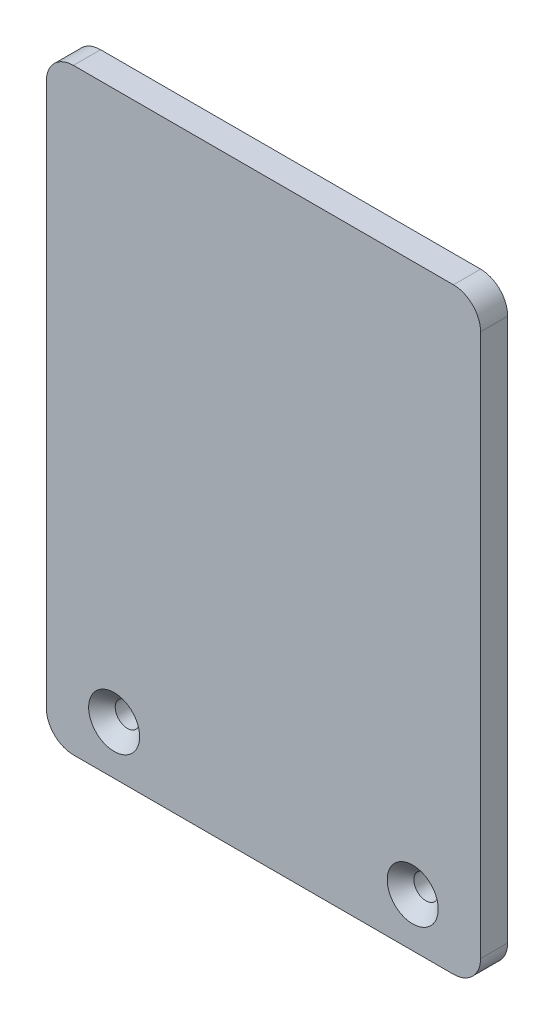
ISO-10303-21;
HEADER;
FILE_DESCRIPTION(('STEP AP214'),'2;1');
FILE_NAME('part.step','',(''),(''),'','','');
FILE_SCHEMA(('AUTOMOTIVE_DESIGN { 1 0 10303 214 1 1 1 1 }'));
ENDSEC;
DATA;
#1=APPLICATION_CONTEXT('core data for automotive mechanical design processes');
#2=APPLICATION_PROTOCOL_DEFINITION('international standard','automotive_design',2000,#1);
#3=PRODUCT_CONTEXT('',#1,'mechanical');
#4=PRODUCT('Part','Part','',(#3));
#5=PRODUCT_RELATED_PRODUCT_CATEGORY('part','',(#4));
#6=PRODUCT_DEFINITION_FORMATION('','',#4);
#7=PRODUCT_DEFINITION_CONTEXT('part definition',#1,'design');
#8=PRODUCT_DEFINITION('design','',#6,#7);
#9=PRODUCT_DEFINITION_SHAPE('','',#8);
#10=(LENGTH_UNIT() NAMED_UNIT(*) SI_UNIT(.MILLI.,.METRE.));
#11=(NAMED_UNIT(*) PLANE_ANGLE_UNIT() SI_UNIT($,.RADIAN.));
#12=(NAMED_UNIT(*) SI_UNIT($,.STERADIAN.) SOLID_ANGLE_UNIT());
#13=UNCERTAINTY_MEASURE_WITH_UNIT(LENGTH_MEASURE(1.E-05),#10,'distance_accuracy_value','');
#14=(GEOMETRIC_REPRESENTATION_CONTEXT(3) GLOBAL_UNCERTAINTY_ASSIGNED_CONTEXT((#13)) GLOBAL_UNIT_ASSIGNED_CONTEXT((#10,
#11,#12)) REPRESENTATION_CONTEXT('',''));
#15=CARTESIAN_POINT('',(0.,0.,0.));
#16=DIRECTION('',(0.,0.,1.));
#17=DIRECTION('',(1.,0.,0.));
#18=AXIS2_PLACEMENT_3D('',#15,#16,#17);
#19=CARTESIAN_POINT('',(-40.,0.,5.));
#20=DIRECTION('',(1.,0.,0.));
#21=DIRECTION('',(0.,0.,-1.));
#22=AXIS2_PLACEMENT_3D('',#19,#20,#21);
#23=PLANE('',#22);
#24=DIRECTION('',(0.,-1.,0.));
#25=VECTOR('',#24,1.);
#26=CARTESIAN_POINT('',(-40.,0.,5.));
#27=LINE('',#26,#25);
#28=CARTESIAN_POINT('',(-40.,105.,5.));
#29=VERTEX_POINT('',#28);
#30=CARTESIAN_POINT('',(-40.,5.,5.));
#31=VERTEX_POINT('',#30);
#32=EDGE_CURVE('E128',#29,#31,#27,.T.);
#33=ORIENTED_EDGE('',*,*,#32,.F.);
#34=DIRECTION('',(0.,0.,-1.));
#35=VECTOR('',#34,1.);
#36=CARTESIAN_POINT('',(-40.,105.,5.));
#37=LINE('',#36,#35);
#38=CARTESIAN_POINT('',(-40.,105.,0.));
#39=VERTEX_POINT('',#38);
#40=EDGE_CURVE('E154',#29,#39,#37,.T.);
#41=ORIENTED_EDGE('',*,*,#40,.T.);
#42=DIRECTION('',(0.,-1.,0.));
#43=VECTOR('',#42,1.);
#44=CARTESIAN_POINT('',(-40.,0.,0.));
#45=LINE('',#44,#43);
#46=CARTESIAN_POINT('',(-40.,5.,0.));
#47=VERTEX_POINT('',#46);
#48=EDGE_CURVE('E159',#39,#47,#45,.T.);
#49=ORIENTED_EDGE('',*,*,#48,.T.);
#50=DIRECTION('',(0.,0.,-1.));
#51=VECTOR('',#50,1.);
#52=CARTESIAN_POINT('',(-40.,5.,5.));
#53=LINE('',#52,#51);
#54=EDGE_CURVE('E152',#47,#31,#53,.F.);
#55=ORIENTED_EDGE('',*,*,#54,.T.);
#56=EDGE_LOOP('',(#33,#41,#49,#55));
#57=FACE_BOUND('',#56,.T.);
#58=ADVANCED_FACE('F34',(#57),#23,.F.);
#59=CARTESIAN_POINT('',(-40.,0.,5.));
#60=DIRECTION('',(0.,1.,0.));
#61=DIRECTION('',(-1.,0.,0.));
#62=AXIS2_PLACEMENT_3D('',#59,#60,#61);
#63=PLANE('',#62);
#64=DIRECTION('',(1.,0.,0.));
#65=VECTOR('',#64,1.);
#66=CARTESIAN_POINT('',(-40.,0.,5.));
#67=LINE('',#66,#65);
#68=CARTESIAN_POINT('',(-35.,0.,5.));
#69=VERTEX_POINT('',#68);
#70=CARTESIAN_POINT('',(35.,0.,5.));
#71=VERTEX_POINT('',#70);
#72=EDGE_CURVE('E131',#69,#71,#67,.T.);
#73=ORIENTED_EDGE('',*,*,#72,.F.);
#74=DIRECTION('',(0.,0.,-1.));
#75=VECTOR('',#74,1.);
#76=CARTESIAN_POINT('',(-35.,0.,5.));
#77=LINE('',#76,#75);
#78=CARTESIAN_POINT('',(-35.,0.,0.));
#79=VERTEX_POINT('',#78);
#80=EDGE_CURVE('E11',#69,#79,#77,.T.);
#81=ORIENTED_EDGE('',*,*,#80,.T.);
#82=DIRECTION('',(1.,0.,0.));
#83=VECTOR('',#82,1.);
#84=CARTESIAN_POINT('',(-40.,0.,0.));
#85=LINE('',#84,#83);
#86=CARTESIAN_POINT('',(35.,0.,0.));
#87=VERTEX_POINT('',#86);
#88=EDGE_CURVE('E133',#79,#87,#85,.T.);
#89=ORIENTED_EDGE('',*,*,#88,.T.);
#90=DIRECTION('',(0.,0.,-1.));
#91=VECTOR('',#90,1.);
#92=CARTESIAN_POINT('',(35.,0.,5.));
#93=LINE('',#92,#91);
#94=EDGE_CURVE('E43',#87,#71,#93,.F.);
#95=ORIENTED_EDGE('',*,*,#94,.T.);
#96=EDGE_LOOP('',(#73,#81,#89,#95));
#97=FACE_BOUND('',#96,.T.);
#98=ADVANCED_FACE('F179',(#97),#63,.F.);
#99=CARTESIAN_POINT('',(40.,0.,5.));
#100=DIRECTION('',(-1.,0.,0.));
#101=DIRECTION('',(0.,0.,1.));
#102=AXIS2_PLACEMENT_3D('',#99,#100,#101);
#103=PLANE('',#102);
#104=DIRECTION('',(0.,1.,0.));
#105=VECTOR('',#104,1.);
#106=CARTESIAN_POINT('',(40.,0.,0.));
#107=LINE('',#106,#105);
#108=CARTESIAN_POINT('',(40.,5.,0.));
#109=VERTEX_POINT('',#108);
#110=CARTESIAN_POINT('',(40.,105.,0.));
#111=VERTEX_POINT('',#110);
#112=EDGE_CURVE('E129',#109,#111,#107,.T.);
#113=ORIENTED_EDGE('',*,*,#112,.T.);
#114=DIRECTION('',(0.,0.,-1.));
#115=VECTOR('',#114,1.);
#116=CARTESIAN_POINT('',(40.,105.,5.));
#117=LINE('',#116,#115);
#118=CARTESIAN_POINT('',(40.,105.,5.));
#119=VERTEX_POINT('',#118);
#120=EDGE_CURVE('E107',#111,#119,#117,.F.);
#121=ORIENTED_EDGE('',*,*,#120,.T.);
#122=DIRECTION('',(0.,1.,0.));
#123=VECTOR('',#122,1.);
#124=CARTESIAN_POINT('',(40.,0.,5.));
#125=LINE('',#124,#123);
#126=CARTESIAN_POINT('',(40.,5.,5.));
#127=VERTEX_POINT('',#126);
#128=EDGE_CURVE('E175',#127,#119,#125,.T.);
#129=ORIENTED_EDGE('',*,*,#128,.F.);
#130=DIRECTION('',(0.,0.,-1.));
#131=VECTOR('',#130,1.);
#132=CARTESIAN_POINT('',(40.,5.,5.));
#133=LINE('',#132,#131);
#134=EDGE_CURVE('E112',#127,#109,#133,.T.);
#135=ORIENTED_EDGE('',*,*,#134,.T.);
#136=EDGE_LOOP('',(#113,#121,#129,#135));
#137=FACE_BOUND('',#136,.T.);
#138=ADVANCED_FACE('F187',(#137),#103,.F.);
#139=CARTESIAN_POINT('',(-40.,110.,5.));
#140=DIRECTION('',(0.,-1.,0.));
#141=DIRECTION('',(0.,0.,-1.));
#142=AXIS2_PLACEMENT_3D('',#139,#140,#141);
#143=PLANE('',#142);
#144=DIRECTION('',(-1.,0.,0.));
#145=VECTOR('',#144,1.);
#146=CARTESIAN_POINT('',(-40.,110.,5.));
#147=LINE('',#146,#145);
#148=CARTESIAN_POINT('',(35.,110.,5.));
#149=VERTEX_POINT('',#148);
#150=CARTESIAN_POINT('',(-35.,110.,5.));
#151=VERTEX_POINT('',#150);
#152=EDGE_CURVE('E122',#149,#151,#147,.T.);
#153=ORIENTED_EDGE('',*,*,#152,.F.);
#154=DIRECTION('',(0.,0.,-1.));
#155=VECTOR('',#154,1.);
#156=CARTESIAN_POINT('',(35.,110.,5.));
#157=LINE('',#156,#155);
#158=CARTESIAN_POINT('',(35.,110.,0.));
#159=VERTEX_POINT('',#158);
#160=EDGE_CURVE('E106',#149,#159,#157,.T.);
#161=ORIENTED_EDGE('',*,*,#160,.T.);
#162=DIRECTION('',(-1.,0.,0.));
#163=VECTOR('',#162,1.);
#164=CARTESIAN_POINT('',(-40.,110.,0.));
#165=LINE('',#164,#163);
#166=CARTESIAN_POINT('',(-35.,110.,0.));
#167=VERTEX_POINT('',#166);
#168=EDGE_CURVE('E119',#159,#167,#165,.T.);
#169=ORIENTED_EDGE('',*,*,#168,.T.);
#170=DIRECTION('',(0.,0.,-1.));
#171=VECTOR('',#170,1.);
#172=CARTESIAN_POINT('',(-35.,110.,5.));
#173=LINE('',#172,#171);
#174=EDGE_CURVE('E124',#167,#151,#173,.F.);
#175=ORIENTED_EDGE('',*,*,#174,.T.);
#176=EDGE_LOOP('',(#153,#161,#169,#175));
#177=FACE_BOUND('',#176,.T.);
#178=ADVANCED_FACE('F118',(#177),#143,.F.);
#179=CARTESIAN_POINT('',(0.,0.,5.));
#180=DIRECTION('',(0.,0.,-1.));
#181=DIRECTION('',(-1.,0.,0.));
#182=AXIS2_PLACEMENT_3D('',#179,#180,#181);
#183=PLANE('',#182);
#184=CARTESIAN_POINT('',(-27.5,9.,5.));
#185=DIRECTION('',(0.,0.,1.));
#186=DIRECTION('',(1.,0.,0.));
#187=AXIS2_PLACEMENT_3D('',#184,#185,#186);
#188=CIRCLE('',#187,4.7);
#189=CARTESIAN_POINT('',(-22.8,9.,5.));
#190=VERTEX_POINT('',#189);
#191=EDGE_CURVE('E244',#190,#190,#188,.T.);
#192=ORIENTED_EDGE('',*,*,#191,.F.);
#193=EDGE_LOOP('',(#192));
#194=FACE_BOUND('',#193,.T.);
#195=CARTESIAN_POINT('',(27.5,8.98736575481463,5.));
#196=DIRECTION('',(0.,0.,1.));
#197=DIRECTION('',(1.,0.,0.));
#198=AXIS2_PLACEMENT_3D('',#195,#196,#197);
#199=CIRCLE('',#198,4.7);
#200=CARTESIAN_POINT('',(32.2,8.98736575481463,5.));
#201=VERTEX_POINT('',#200);
#202=EDGE_CURVE('E166',#201,#201,#199,.T.);
#203=ORIENTED_EDGE('',*,*,#202,.F.);
#204=EDGE_LOOP('',(#203));
#205=FACE_BOUND('',#204,.T.);
#206=ORIENTED_EDGE('',*,*,#128,.T.);
#207=CARTESIAN_POINT('',(35.,105.,5.));
#208=DIRECTION('',(0.,0.,-1.));
#209=DIRECTION('',(-1.,0.,0.));
#210=AXIS2_PLACEMENT_3D('',#207,#208,#209);
#211=CIRCLE('',#210,5.);
#212=EDGE_CURVE('E150',#119,#149,#211,.F.);
#213=ORIENTED_EDGE('',*,*,#212,.T.);
#214=ORIENTED_EDGE('',*,*,#152,.T.);
#215=CARTESIAN_POINT('',(-35.,105.,5.));
#216=DIRECTION('',(0.,0.,-1.));
#217=DIRECTION('',(-1.,0.,0.));
#218=AXIS2_PLACEMENT_3D('',#215,#216,#217);
#219=CIRCLE('',#218,5.);
#220=EDGE_CURVE('E148',#151,#29,#219,.F.);
#221=ORIENTED_EDGE('',*,*,#220,.T.);
#222=ORIENTED_EDGE('',*,*,#32,.T.);
#223=CARTESIAN_POINT('',(-35.,5.,5.));
#224=DIRECTION('',(0.,0.,-1.));
#225=DIRECTION('',(-1.,0.,0.));
#226=AXIS2_PLACEMENT_3D('',#223,#224,#225);
#227=CIRCLE('',#226,5.);
#228=EDGE_CURVE('E57',#31,#69,#227,.F.);
#229=ORIENTED_EDGE('',*,*,#228,.T.);
#230=ORIENTED_EDGE('',*,*,#72,.T.);
#231=CARTESIAN_POINT('',(35.,5.,5.));
#232=DIRECTION('',(0.,0.,-1.));
#233=DIRECTION('',(-1.,0.,0.));
#234=AXIS2_PLACEMENT_3D('',#231,#232,#233);
#235=CIRCLE('',#234,5.);
#236=EDGE_CURVE('E145',#71,#127,#235,.F.);
#237=ORIENTED_EDGE('',*,*,#236,.T.);
#238=EDGE_LOOP('',(#206,#213,#214,#221,#222,#229,#230,#237));
#239=FACE_BOUND('',#238,.T.);
#240=ADVANCED_FACE('F185',(#194,#205,#239),#183,.F.);
#241=CARTESIAN_POINT('',(0.,0.,0.));
#242=DIRECTION('',(0.,0.,-1.));
#243=DIRECTION('',(-1.,0.,0.));
#244=AXIS2_PLACEMENT_3D('',#241,#242,#243);
#245=PLANE('',#244);
#246=CARTESIAN_POINT('',(-27.5,9.,0.));
#247=DIRECTION('',(0.,0.,-1.));
#248=DIRECTION('',(-1.,0.,0.));
#249=AXIS2_PLACEMENT_3D('',#246,#247,#248);
#250=CIRCLE('',#249,2.25);
#251=CARTESIAN_POINT('',(-29.75,9.,0.));
#252=VERTEX_POINT('',#251);
#253=EDGE_CURVE('E38',#252,#252,#250,.T.);
#254=ORIENTED_EDGE('',*,*,#253,.F.);
#255=EDGE_LOOP('',(#254));
#256=FACE_BOUND('',#255,.T.);
#257=CARTESIAN_POINT('',(27.5,8.98736575481463,0.));
#258=DIRECTION('',(0.,0.,-1.));
#259=DIRECTION('',(-1.,0.,0.));
#260=AXIS2_PLACEMENT_3D('',#257,#258,#259);
#261=CIRCLE('',#260,2.25);
#262=CARTESIAN_POINT('',(25.25,8.98736575481463,0.));
#263=VERTEX_POINT('',#262);
#264=EDGE_CURVE('E157',#263,#263,#261,.T.);
#265=ORIENTED_EDGE('',*,*,#264,.F.);
#266=EDGE_LOOP('',(#265));
#267=FACE_BOUND('',#266,.T.);
#268=ORIENTED_EDGE('',*,*,#168,.F.);
#269=CARTESIAN_POINT('',(35.,105.,0.));
#270=DIRECTION('',(0.,0.,-1.));
#271=DIRECTION('',(-1.,0.,0.));
#272=AXIS2_PLACEMENT_3D('',#269,#270,#271);
#273=CIRCLE('',#272,5.);
#274=EDGE_CURVE('E102',#159,#111,#273,.T.);
#275=ORIENTED_EDGE('',*,*,#274,.T.);
#276=ORIENTED_EDGE('',*,*,#112,.F.);
#277=CARTESIAN_POINT('',(35.,5.,0.));
#278=DIRECTION('',(0.,0.,-1.));
#279=DIRECTION('',(-1.,0.,0.));
#280=AXIS2_PLACEMENT_3D('',#277,#278,#279);
#281=CIRCLE('',#280,5.);
#282=EDGE_CURVE('E123',#109,#87,#281,.T.);
#283=ORIENTED_EDGE('',*,*,#282,.T.);
#284=ORIENTED_EDGE('',*,*,#88,.F.);
#285=CARTESIAN_POINT('',(-35.,5.,0.));
#286=DIRECTION('',(0.,0.,-1.));
#287=DIRECTION('',(-1.,0.,0.));
#288=AXIS2_PLACEMENT_3D('',#285,#286,#287);
#289=CIRCLE('',#288,5.);
#290=EDGE_CURVE('E139',#79,#47,#289,.T.);
#291=ORIENTED_EDGE('',*,*,#290,.T.);
#292=ORIENTED_EDGE('',*,*,#48,.F.);
#293=CARTESIAN_POINT('',(-35.,105.,0.));
#294=DIRECTION('',(0.,0.,-1.));
#295=DIRECTION('',(-1.,0.,0.));
#296=AXIS2_PLACEMENT_3D('',#293,#294,#295);
#297=CIRCLE('',#296,5.);
#298=EDGE_CURVE('E113',#39,#167,#297,.T.);
#299=ORIENTED_EDGE('',*,*,#298,.T.);
#300=EDGE_LOOP('',(#268,#275,#276,#283,#284,#291,#292,#299));
#301=FACE_BOUND('',#300,.T.);
#302=ADVANCED_FACE('F126',(#256,#267,#301),#245,.T.);
#303=CARTESIAN_POINT('',(35.,105.,5.));
#304=DIRECTION('',(0.,0.,-1.));
#305=DIRECTION('',(-1.,0.,0.));
#306=AXIS2_PLACEMENT_3D('',#303,#304,#305);
#307=CYLINDRICAL_SURFACE('',#306,5.);
#308=ORIENTED_EDGE('',*,*,#212,.F.);
#309=ORIENTED_EDGE('',*,*,#120,.F.);
#310=ORIENTED_EDGE('',*,*,#274,.F.);
#311=ORIENTED_EDGE('',*,*,#160,.F.);
#312=EDGE_LOOP('',(#308,#309,#310,#311));
#313=FACE_BOUND('',#312,.T.);
#314=ADVANCED_FACE('F105',(#313),#307,.T.);
#315=CARTESIAN_POINT('',(-35.,105.,5.));
#316=DIRECTION('',(0.,0.,-1.));
#317=DIRECTION('',(-1.,0.,0.));
#318=AXIS2_PLACEMENT_3D('',#315,#316,#317);
#319=CYLINDRICAL_SURFACE('',#318,5.);
#320=ORIENTED_EDGE('',*,*,#220,.F.);
#321=ORIENTED_EDGE('',*,*,#174,.F.);
#322=ORIENTED_EDGE('',*,*,#298,.F.);
#323=ORIENTED_EDGE('',*,*,#40,.F.);
#324=EDGE_LOOP('',(#320,#321,#322,#323));
#325=FACE_BOUND('',#324,.T.);
#326=ADVANCED_FACE('F205',(#325),#319,.T.);
#327=CARTESIAN_POINT('',(-35.,5.,5.));
#328=DIRECTION('',(0.,0.,-1.));
#329=DIRECTION('',(-1.,0.,0.));
#330=AXIS2_PLACEMENT_3D('',#327,#328,#329);
#331=CYLINDRICAL_SURFACE('',#330,5.);
#332=ORIENTED_EDGE('',*,*,#228,.F.);
#333=ORIENTED_EDGE('',*,*,#54,.F.);
#334=ORIENTED_EDGE('',*,*,#290,.F.);
#335=ORIENTED_EDGE('',*,*,#80,.F.);
#336=EDGE_LOOP('',(#332,#333,#334,#335));
#337=FACE_BOUND('',#336,.T.);
#338=ADVANCED_FACE('F207',(#337),#331,.T.);
#339=CARTESIAN_POINT('',(35.,5.,5.));
#340=DIRECTION('',(0.,0.,-1.));
#341=DIRECTION('',(-1.,0.,0.));
#342=AXIS2_PLACEMENT_3D('',#339,#340,#341);
#343=CYLINDRICAL_SURFACE('',#342,5.);
#344=ORIENTED_EDGE('',*,*,#236,.F.);
#345=ORIENTED_EDGE('',*,*,#94,.F.);
#346=ORIENTED_EDGE('',*,*,#282,.F.);
#347=ORIENTED_EDGE('',*,*,#134,.F.);
#348=EDGE_LOOP('',(#344,#345,#346,#347));
#349=FACE_BOUND('',#348,.T.);
#350=ADVANCED_FACE('F36',(#349),#343,.T.);
#351=CARTESIAN_POINT('',(27.5,8.98736575481463,5.));
#352=DIRECTION('',(0.,0.,1.));
#353=DIRECTION('',(1.,0.,0.));
#354=AXIS2_PLACEMENT_3D('',#351,#352,#353);
#355=CYLINDRICAL_SURFACE('',#354,2.25);
#356=ORIENTED_EDGE('',*,*,#264,.T.);
#357=EDGE_LOOP('',(#356));
#358=FACE_BOUND('',#357,.T.);
#359=CARTESIAN_POINT('',(27.5,8.98736575481463,2.55));
#360=DIRECTION('',(0.,0.,1.));
#361=DIRECTION('',(1.,0.,0.));
#362=AXIS2_PLACEMENT_3D('',#359,#360,#361);
#363=CIRCLE('',#362,2.25);
#364=CARTESIAN_POINT('',(29.75,8.98736575481463,2.55));
#365=VERTEX_POINT('',#364);
#366=EDGE_CURVE('E160',#365,#365,#363,.T.);
#367=ORIENTED_EDGE('',*,*,#366,.T.);
#368=EDGE_LOOP('',(#367));
#369=FACE_BOUND('',#368,.T.);
#370=ADVANCED_FACE('F214',(#358,#369),#355,.F.);
#371=CARTESIAN_POINT('',(27.5,8.98736575481463,5.));
#372=DIRECTION('',(0.,0.,1.));
#373=DIRECTION('',(1.,0.,0.));
#374=AXIS2_PLACEMENT_3D('',#371,#372,#373);
#375=CONICAL_SURFACE('',#374,4.7,0.785398163397449);
#376=ORIENTED_EDGE('',*,*,#366,.F.);
#377=EDGE_LOOP('',(#376));
#378=FACE_BOUND('',#377,.T.);
#379=ORIENTED_EDGE('',*,*,#202,.T.);
#380=EDGE_LOOP('',(#379));
#381=FACE_BOUND('',#380,.T.);
#382=ADVANCED_FACE('F221',(#378,#381),#375,.F.);
#383=CARTESIAN_POINT('',(-27.5,9.,5.));
#384=DIRECTION('',(0.,0.,1.));
#385=DIRECTION('',(1.,0.,0.));
#386=AXIS2_PLACEMENT_3D('',#383,#384,#385);
#387=CYLINDRICAL_SURFACE('',#386,2.25);
#388=ORIENTED_EDGE('',*,*,#253,.T.);
#389=EDGE_LOOP('',(#388));
#390=FACE_BOUND('',#389,.T.);
#391=CARTESIAN_POINT('',(-27.5,9.,2.55));
#392=DIRECTION('',(0.,0.,1.));
#393=DIRECTION('',(1.,0.,0.));
#394=AXIS2_PLACEMENT_3D('',#391,#392,#393);
#395=CIRCLE('',#394,2.25);
#396=CARTESIAN_POINT('',(-25.25,9.,2.55));
#397=VERTEX_POINT('',#396);
#398=EDGE_CURVE('E242',#397,#397,#395,.T.);
#399=ORIENTED_EDGE('',*,*,#398,.T.);
#400=EDGE_LOOP('',(#399));
#401=FACE_BOUND('',#400,.T.);
#402=ADVANCED_FACE('F226',(#390,#401),#387,.F.);
#403=CARTESIAN_POINT('',(-27.5,9.,5.));
#404=DIRECTION('',(0.,0.,1.));
#405=DIRECTION('',(1.,0.,0.));
#406=AXIS2_PLACEMENT_3D('',#403,#404,#405);
#407=CONICAL_SURFACE('',#406,4.7,0.785398163397449);
#408=ORIENTED_EDGE('',*,*,#398,.F.);
#409=EDGE_LOOP('',(#408));
#410=FACE_BOUND('',#409,.T.);
#411=ORIENTED_EDGE('',*,*,#191,.T.);
#412=EDGE_LOOP('',(#411));
#413=FACE_BOUND('',#412,.T.);
#414=ADVANCED_FACE('F251',(#410,#413),#407,.F.);
#415=CLOSED_SHELL('',(#58,#98,#138,#178,#240,#302,#314,#326,#338,#350,#370,#382,#402,#414));
#416=MANIFOLD_SOLID_BREP('B2',#415);
#417=ADVANCED_BREP_SHAPE_REPRESENTATION('',(#18,#416),#14);
#418=SHAPE_DEFINITION_REPRESENTATION(#9,#417);
ENDSEC;
END-ISO-10303-21;
